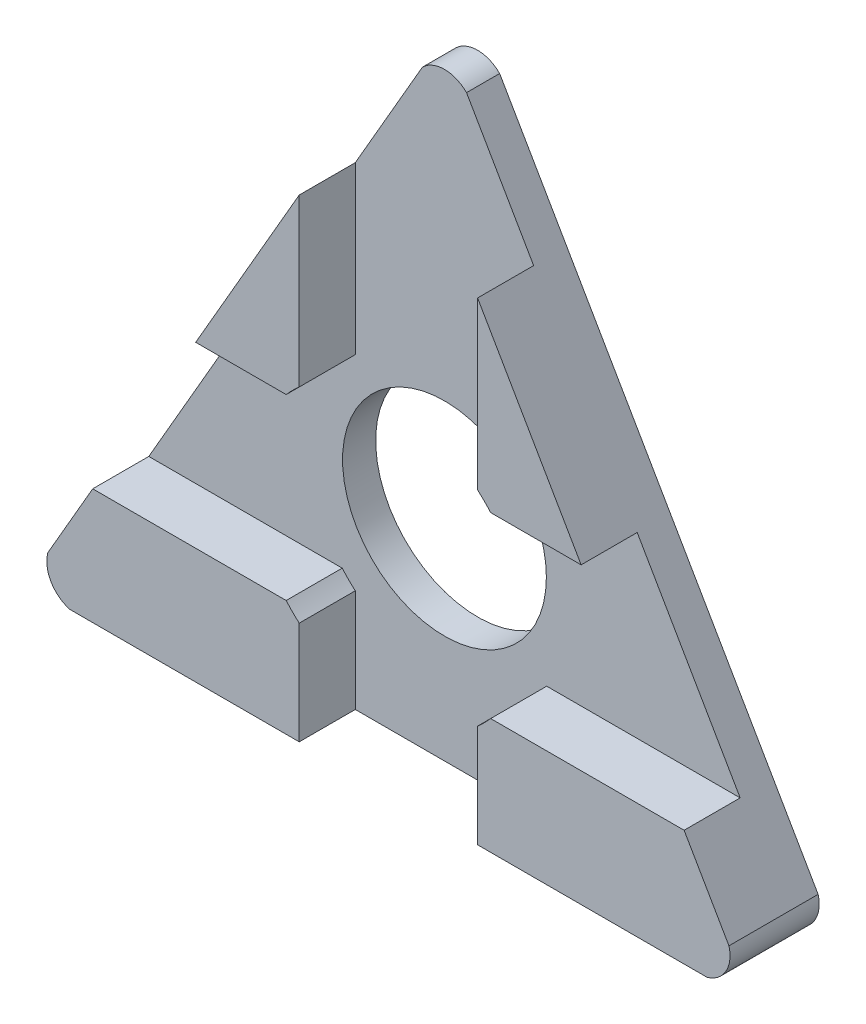
ISO-10303-21;
HEADER;
FILE_DESCRIPTION(('STEP AP214'),'2;1');
FILE_NAME('part.step','',(''),(''),'','','');
FILE_SCHEMA(('AUTOMOTIVE_DESIGN { 1 0 10303 214 1 1 1 1 }'));
ENDSEC;
DATA;
#1=APPLICATION_CONTEXT('core data for automotive mechanical design processes');
#2=APPLICATION_PROTOCOL_DEFINITION('international standard','automotive_design',2000,#1);
#3=PRODUCT_CONTEXT('',#1,'mechanical');
#4=PRODUCT('Part','Part','',(#3));
#5=PRODUCT_RELATED_PRODUCT_CATEGORY('part','',(#4));
#6=PRODUCT_DEFINITION_FORMATION('','',#4);
#7=PRODUCT_DEFINITION_CONTEXT('part definition',#1,'design');
#8=PRODUCT_DEFINITION('design','',#6,#7);
#9=PRODUCT_DEFINITION_SHAPE('','',#8);
#10=(LENGTH_UNIT() NAMED_UNIT(*) SI_UNIT(.MILLI.,.METRE.));
#11=(NAMED_UNIT(*) PLANE_ANGLE_UNIT() SI_UNIT($,.RADIAN.));
#12=(NAMED_UNIT(*) SI_UNIT($,.STERADIAN.) SOLID_ANGLE_UNIT());
#13=UNCERTAINTY_MEASURE_WITH_UNIT(LENGTH_MEASURE(1.E-05),#10,'distance_accuracy_value','');
#14=(GEOMETRIC_REPRESENTATION_CONTEXT(3) GLOBAL_UNCERTAINTY_ASSIGNED_CONTEXT((#13)) GLOBAL_UNIT_ASSIGNED_CONTEXT((#10,
#11,#12)) REPRESENTATION_CONTEXT('',''));
#15=CARTESIAN_POINT('',(0.,0.,0.));
#16=DIRECTION('',(0.,0.,1.));
#17=DIRECTION('',(1.,0.,0.));
#18=AXIS2_PLACEMENT_3D('',#15,#16,#17);
#19=CARTESIAN_POINT('',(0.,0.,3.5));
#20=DIRECTION('',(0.,0.,1.));
#21=DIRECTION('',(1.,0.,0.));
#22=AXIS2_PLACEMENT_3D('',#19,#20,#21);
#23=PLANE('',#22);
#24=DIRECTION('',(0.,-1.,0.));
#25=VECTOR('',#24,1.);
#26=CARTESIAN_POINT('',(-3.5,10.5487813318509,3.5));
#27=LINE('',#26,#25);
#28=CARTESIAN_POINT('',(-3.5,17.5884572681199,3.5));
#29=VERTEX_POINT('',#28);
#30=CARTESIAN_POINT('',(-3.5,11.0619627381669,3.5));
#31=VERTEX_POINT('',#30);
#32=EDGE_CURVE('E189',#29,#31,#27,.T.);
#33=ORIENTED_EDGE('',*,*,#32,.F.);
#34=DIRECTION('',(0.5,0.866025403784439,0.));
#35=VECTOR('',#34,1.);
#36=CARTESIAN_POINT('',(-0.866025403784438,22.150635094611,3.5));
#37=LINE('',#36,#35);
#38=CARTESIAN_POINT('',(-7.56435879681262,10.5487813318509,3.5));
#39=VERTEX_POINT('',#38);
#40=EDGE_CURVE('E201',#39,#29,#37,.T.);
#41=ORIENTED_EDGE('',*,*,#40,.F.);
#42=DIRECTION('',(-1.,0.,0.));
#43=VECTOR('',#42,1.);
#44=CARTESIAN_POINT('',(-19.2590358206957,10.5487813318509,3.5));
#45=LINE('',#44,#43);
#46=CARTESIAN_POINT('',(-4.01318140631594,10.5487813318509,3.5));
#47=VERTEX_POINT('',#46);
#48=EDGE_CURVE('E204',#47,#39,#45,.T.);
#49=ORIENTED_EDGE('',*,*,#48,.F.);
#50=CARTESIAN_POINT('',(0.,7.04878133185094,3.5));
#51=DIRECTION('',(0.,0.,1.));
#52=DIRECTION('',(1.,0.,0.));
#53=AXIS2_PLACEMENT_3D('',#50,#51,#52);
#54=CIRCLE('',#53,5.325);
#55=EDGE_CURVE('E203',#31,#47,#54,.T.);
#56=ORIENTED_EDGE('',*,*,#55,.F.);
#57=EDGE_LOOP('',(#33,#41,#49,#56));
#58=FACE_BOUND('',#57,.T.);
#59=ADVANCED_FACE('F35',(#58),#23,.T.);
#60=DIRECTION('',(0.,1.,0.));
#61=VECTOR('',#60,1.);
#62=CARTESIAN_POINT('',(3.5,10.5487813318509,3.5));
#63=LINE('',#62,#61);
#64=CARTESIAN_POINT('',(3.5,11.0619627381669,3.5));
#65=VERTEX_POINT('',#64);
#66=CARTESIAN_POINT('',(3.5,17.5884572681199,3.5));
#67=VERTEX_POINT('',#66);
#68=EDGE_CURVE('E333',#65,#67,#63,.T.);
#69=ORIENTED_EDGE('',*,*,#68,.F.);
#70=CARTESIAN_POINT('',(4.01318140631594,10.5487813318509,3.5));
#71=VERTEX_POINT('',#70);
#72=EDGE_CURVE('E282',#71,#65,#54,.T.);
#73=ORIENTED_EDGE('',*,*,#72,.F.);
#74=DIRECTION('',(-1.,0.,0.));
#75=VECTOR('',#74,1.);
#76=CARTESIAN_POINT('',(20.8756332372673,10.5487813318509,3.5));
#77=LINE('',#76,#75);
#78=CARTESIAN_POINT('',(7.56435879681262,10.5487813318509,3.5));
#79=VERTEX_POINT('',#78);
#80=EDGE_CURVE('E331',#79,#71,#77,.T.);
#81=ORIENTED_EDGE('',*,*,#80,.F.);
#82=DIRECTION('',(0.5,-0.866025403784439,0.));
#83=VECTOR('',#82,1.);
#84=CARTESIAN_POINT('',(0.866025403784439,22.150635094611,3.5));
#85=LINE('',#84,#83);
#86=EDGE_CURVE('E221',#67,#79,#85,.T.);
#87=ORIENTED_EDGE('',*,*,#86,.F.);
#88=EDGE_LOOP('',(#69,#73,#81,#87));
#89=FACE_BOUND('',#88,.T.);
#90=ADVANCED_FACE('F366',(#89),#23,.T.);
#91=DIRECTION('',(1.,0.,0.));
#92=VECTOR('',#91,1.);
#93=CARTESIAN_POINT('',(20.8756332372673,3.54878133185094,3.5));
#94=LINE('',#93,#92);
#95=CARTESIAN_POINT('',(4.01318140631594,3.54878133185094,3.5));
#96=VERTEX_POINT('',#95);
#97=CARTESIAN_POINT('',(11.60581068114,3.54878133185093,3.5));
#98=VERTEX_POINT('',#97);
#99=EDGE_CURVE('E325',#96,#98,#94,.T.);
#100=ORIENTED_EDGE('',*,*,#99,.F.);
#101=CARTESIAN_POINT('',(3.5,3.035599925535,3.5));
#102=VERTEX_POINT('',#101);
#103=EDGE_CURVE('E194',#102,#96,#54,.T.);
#104=ORIENTED_EDGE('',*,*,#103,.F.);
#105=DIRECTION('',(0.,1.,0.));
#106=VECTOR('',#105,1.);
#107=CARTESIAN_POINT('',(3.5,3.54878133185094,3.5));
#108=LINE('',#107,#106);
#109=CARTESIAN_POINT('',(3.5,-1.,3.5));
#110=VERTEX_POINT('',#109);
#111=EDGE_CURVE('E323',#110,#102,#108,.T.);
#112=ORIENTED_EDGE('',*,*,#111,.F.);
#113=DIRECTION('',(-1.,0.,0.));
#114=VECTOR('',#113,1.);
#115=CARTESIAN_POINT('',(-12.5,-1.,3.5));
#116=LINE('',#115,#114);
#117=CARTESIAN_POINT('',(12.5,-1.,3.5));
#118=VERTEX_POINT('',#117);
#119=EDGE_CURVE('E216',#118,#110,#116,.T.);
#120=ORIENTED_EDGE('',*,*,#119,.F.);
#121=CARTESIAN_POINT('',(12.1830127018922,0.183012701892222,3.5));
#122=DIRECTION('',(0.,0.,-1.));
#123=DIRECTION('',(1.,0.,0.));
#124=AXIS2_PLACEMENT_3D('',#121,#122,#123);
#125=CIRCLE('',#124,1.2247448713916);
#126=CARTESIAN_POINT('',(13.3660254037844,0.500000000000001,3.5));
#127=VERTEX_POINT('',#126);
#128=EDGE_CURVE('E241',#127,#118,#125,.T.);
#129=ORIENTED_EDGE('',*,*,#128,.F.);
#130=EDGE_CURVE('E214',#98,#127,#85,.T.);
#131=ORIENTED_EDGE('',*,*,#130,.F.);
#132=EDGE_LOOP('',(#100,#104,#112,#120,#129,#131));
#133=FACE_BOUND('',#132,.T.);
#134=ADVANCED_FACE('F402',(#133),#23,.T.);
#135=CARTESIAN_POINT('',(0.,7.04878133185094,1.3));
#136=DIRECTION('',(0.,0.,1.));
#137=DIRECTION('',(1.,0.,0.));
#138=AXIS2_PLACEMENT_3D('',#135,#136,#137);
#139=CYLINDRICAL_SURFACE('',#138,5.325);
#140=CARTESIAN_POINT('',(0.,7.04878133185094,1.3));
#141=DIRECTION('',(0.,0.,1.));
#142=DIRECTION('',(1.,0.,0.));
#143=AXIS2_PLACEMENT_3D('',#140,#141,#142);
#144=CIRCLE('',#143,5.325);
#145=CARTESIAN_POINT('',(-3.5,11.0619627381669,1.3));
#146=VERTEX_POINT('',#145);
#147=CARTESIAN_POINT('',(-4.01318140631594,10.5487813318509,1.3));
#148=VERTEX_POINT('',#147);
#149=EDGE_CURVE('E293',#146,#148,#144,.T.);
#150=ORIENTED_EDGE('',*,*,#149,.F.);
#151=DIRECTION('',(0.,0.,1.));
#152=VECTOR('',#151,1.);
#153=CARTESIAN_POINT('',(-3.5,11.0619627381669,1.3));
#154=LINE('',#153,#152);
#155=EDGE_CURVE('E11',#146,#31,#154,.T.);
#156=ORIENTED_EDGE('',*,*,#155,.T.);
#157=ORIENTED_EDGE('',*,*,#55,.T.);
#158=DIRECTION('',(0.,0.,1.));
#159=VECTOR('',#158,1.);
#160=CARTESIAN_POINT('',(-4.01318140631594,10.5487813318509,1.3));
#161=LINE('',#160,#159);
#162=EDGE_CURVE('E244',#47,#148,#161,.F.);
#163=ORIENTED_EDGE('',*,*,#162,.T.);
#164=EDGE_LOOP('',(#150,#156,#157,#163));
#165=FACE_BOUND('',#164,.T.);
#166=ADVANCED_FACE('F385',(#165),#139,.F.);
#167=ORIENTED_EDGE('',*,*,#72,.T.);
#168=DIRECTION('',(0.,0.,1.));
#169=VECTOR('',#168,1.);
#170=CARTESIAN_POINT('',(3.5,11.0619627381669,1.3));
#171=LINE('',#170,#169);
#172=CARTESIAN_POINT('',(3.5,11.0619627381669,1.3));
#173=VERTEX_POINT('',#172);
#174=EDGE_CURVE('E43',#65,#173,#171,.F.);
#175=ORIENTED_EDGE('',*,*,#174,.T.);
#176=CARTESIAN_POINT('',(4.01318140631594,10.5487813318509,1.3));
#177=VERTEX_POINT('',#176);
#178=EDGE_CURVE('E258',#177,#173,#144,.T.);
#179=ORIENTED_EDGE('',*,*,#178,.F.);
#180=DIRECTION('',(0.,0.,1.));
#181=VECTOR('',#180,1.);
#182=CARTESIAN_POINT('',(4.01318140631594,10.5487813318509,1.3));
#183=LINE('',#182,#181);
#184=EDGE_CURVE('E273',#177,#71,#183,.T.);
#185=ORIENTED_EDGE('',*,*,#184,.T.);
#186=EDGE_LOOP('',(#167,#175,#179,#185));
#187=FACE_BOUND('',#186,.T.);
#188=ADVANCED_FACE('F280',(#187),#139,.F.);
#189=ORIENTED_EDGE('',*,*,#103,.T.);
#190=DIRECTION('',(0.,0.,1.));
#191=VECTOR('',#190,1.);
#192=CARTESIAN_POINT('',(4.01318140631594,3.54878133185094,1.3));
#193=LINE('',#192,#191);
#194=CARTESIAN_POINT('',(4.01318140631594,3.54878133185094,1.3));
#195=VERTEX_POINT('',#194);
#196=EDGE_CURVE('E270',#96,#195,#193,.F.);
#197=ORIENTED_EDGE('',*,*,#196,.T.);
#198=CARTESIAN_POINT('',(3.5,3.035599925535,1.3));
#199=VERTEX_POINT('',#198);
#200=EDGE_CURVE('E295',#199,#195,#144,.T.);
#201=ORIENTED_EDGE('',*,*,#200,.F.);
#202=DIRECTION('',(0.,0.,1.));
#203=VECTOR('',#202,1.);
#204=CARTESIAN_POINT('',(3.5,3.035599925535,1.3));
#205=LINE('',#204,#203);
#206=EDGE_CURVE('E267',#199,#102,#205,.T.);
#207=ORIENTED_EDGE('',*,*,#206,.T.);
#208=EDGE_LOOP('',(#189,#197,#201,#207));
#209=FACE_BOUND('',#208,.T.);
#210=ADVANCED_FACE('F406',(#209),#139,.F.);
#211=CARTESIAN_POINT('',(0.,7.24327674041975,0.));
#212=DIRECTION('',(0.,0.,1.));
#213=DIRECTION('',(1.,0.,0.));
#214=AXIS2_PLACEMENT_3D('',#211,#212,#213);
#215=CYLINDRICAL_SURFACE('',#214,4.);
#216=CARTESIAN_POINT('',(0.,7.24327674041975,0.));
#217=DIRECTION('',(0.,0.,1.));
#218=DIRECTION('',(1.,0.,0.));
#219=AXIS2_PLACEMENT_3D('',#216,#217,#218);
#220=CIRCLE('',#219,4.);
#221=CARTESIAN_POINT('',(4.,7.24327674041975,0.));
#222=VERTEX_POINT('',#221);
#223=EDGE_CURVE('E226',#222,#222,#220,.T.);
#224=ORIENTED_EDGE('',*,*,#223,.F.);
#225=EDGE_LOOP('',(#224));
#226=FACE_BOUND('',#225,.T.);
#227=CARTESIAN_POINT('',(0.,7.24327674041975,1.3));
#228=DIRECTION('',(0.,0.,1.));
#229=DIRECTION('',(1.,0.,0.));
#230=AXIS2_PLACEMENT_3D('',#227,#228,#229);
#231=CIRCLE('',#230,4.);
#232=CARTESIAN_POINT('',(4.,7.24327674041975,1.3));
#233=VERTEX_POINT('',#232);
#234=EDGE_CURVE('E255',#233,#233,#231,.F.);
#235=ORIENTED_EDGE('',*,*,#234,.F.);
#236=EDGE_LOOP('',(#235));
#237=FACE_BOUND('',#236,.T.);
#238=ADVANCED_FACE('F408',(#226,#237),#215,.F.);
#239=DIRECTION('',(0.,-1.,0.));
#240=VECTOR('',#239,1.);
#241=CARTESIAN_POINT('',(-3.5,3.54878133185094,3.5));
#242=LINE('',#241,#240);
#243=CARTESIAN_POINT('',(-3.5,3.035599925535,3.5));
#244=VERTEX_POINT('',#243);
#245=CARTESIAN_POINT('',(-3.5,-1.,3.5));
#246=VERTEX_POINT('',#245);
#247=EDGE_CURVE('E318',#244,#246,#242,.T.);
#248=ORIENTED_EDGE('',*,*,#247,.F.);
#249=CARTESIAN_POINT('',(-4.01318140631594,3.54878133185094,3.5));
#250=VERTEX_POINT('',#249);
#251=EDGE_CURVE('E301',#250,#244,#54,.T.);
#252=ORIENTED_EDGE('',*,*,#251,.F.);
#253=DIRECTION('',(1.,0.,0.));
#254=VECTOR('',#253,1.);
#255=CARTESIAN_POINT('',(-19.2590358206957,3.54878133185094,3.5));
#256=LINE('',#255,#254);
#257=CARTESIAN_POINT('',(-11.60581068114,3.54878133185093,3.5));
#258=VERTEX_POINT('',#257);
#259=EDGE_CURVE('E316',#258,#250,#256,.T.);
#260=ORIENTED_EDGE('',*,*,#259,.F.);
#261=CARTESIAN_POINT('',(-13.3660254037844,0.500000000000001,3.5));
#262=VERTEX_POINT('',#261);
#263=EDGE_CURVE('E210',#262,#258,#37,.T.);
#264=ORIENTED_EDGE('',*,*,#263,.F.);
#265=CARTESIAN_POINT('',(-12.1830127018922,0.183012701892222,3.5));
#266=DIRECTION('',(0.,0.,-1.));
#267=DIRECTION('',(1.,0.,0.));
#268=AXIS2_PLACEMENT_3D('',#265,#266,#267);
#269=CIRCLE('',#268,1.22474487139159);
#270=CARTESIAN_POINT('',(-12.5,-1.,3.5));
#271=VERTEX_POINT('',#270);
#272=EDGE_CURVE('E211',#271,#262,#269,.T.);
#273=ORIENTED_EDGE('',*,*,#272,.F.);
#274=EDGE_CURVE('E320',#246,#271,#116,.T.);
#275=ORIENTED_EDGE('',*,*,#274,.F.);
#276=EDGE_LOOP('',(#248,#252,#260,#264,#273,#275));
#277=FACE_BOUND('',#276,.T.);
#278=ADVANCED_FACE('F314',(#277),#23,.T.);
#279=CARTESIAN_POINT('',(12.1830127018922,0.183012701892222,3.5));
#280=DIRECTION('',(0.,0.,-1.));
#281=DIRECTION('',(-1.,0.,0.));
#282=AXIS2_PLACEMENT_3D('',#279,#280,#281);
#283=CYLINDRICAL_SURFACE('',#282,1.2247448713916);
#284=CARTESIAN_POINT('',(12.1830127018922,0.183012701892222,0.));
#285=DIRECTION('',(0.,0.,-1.));
#286=DIRECTION('',(1.,0.,0.));
#287=AXIS2_PLACEMENT_3D('',#284,#285,#286);
#288=CIRCLE('',#287,1.2247448713916);
#289=CARTESIAN_POINT('',(13.3660254037844,0.500000000000001,0.));
#290=VERTEX_POINT('',#289);
#291=CARTESIAN_POINT('',(12.5,-1.,0.));
#292=VERTEX_POINT('',#291);
#293=EDGE_CURVE('E222',#290,#292,#288,.T.);
#294=ORIENTED_EDGE('',*,*,#293,.F.);
#295=DIRECTION('',(0.,0.,-1.));
#296=VECTOR('',#295,1.);
#297=CARTESIAN_POINT('',(13.3660254037844,0.500000000000001,3.5));
#298=LINE('',#297,#296);
#299=EDGE_CURVE('E242',#127,#290,#298,.T.);
#300=ORIENTED_EDGE('',*,*,#299,.F.);
#301=ORIENTED_EDGE('',*,*,#128,.T.);
#302=DIRECTION('',(0.,0.,-1.));
#303=VECTOR('',#302,1.);
#304=CARTESIAN_POINT('',(12.5,-1.,3.5));
#305=LINE('',#304,#303);
#306=EDGE_CURVE('E253',#118,#292,#305,.T.);
#307=ORIENTED_EDGE('',*,*,#306,.T.);
#308=EDGE_LOOP('',(#294,#300,#301,#307));
#309=FACE_BOUND('',#308,.T.);
#310=ADVANCED_FACE('F425',(#309),#283,.T.);
#311=CARTESIAN_POINT('',(0.866025403784439,22.150635094611,3.5));
#312=DIRECTION('',(0.866025403784439,0.5,0.));
#313=DIRECTION('',(-0.5,0.866025403784439,0.));
#314=AXIS2_PLACEMENT_3D('',#311,#312,#313);
#315=PLANE('',#314);
#316=DIRECTION('',(0.,0.,1.));
#317=VECTOR('',#316,1.);
#318=CARTESIAN_POINT('',(7.56435879681261,10.5487813318509,3.5));
#319=LINE('',#318,#317);
#320=CARTESIAN_POINT('',(7.56435879681262,10.5487813318509,1.3));
#321=VERTEX_POINT('',#320);
#322=EDGE_CURVE('E354',#321,#79,#319,.T.);
#323=ORIENTED_EDGE('',*,*,#322,.F.);
#324=DIRECTION('',(-0.5,0.866025403784439,0.));
#325=VECTOR('',#324,1.);
#326=CARTESIAN_POINT('',(0.866025403784439,22.150635094611,1.3));
#327=LINE('',#326,#325);
#328=CARTESIAN_POINT('',(11.60581068114,3.54878133185093,1.3));
#329=VERTEX_POINT('',#328);
#330=EDGE_CURVE('E344',#329,#321,#327,.T.);
#331=ORIENTED_EDGE('',*,*,#330,.F.);
#332=DIRECTION('',(0.,0.,-1.));
#333=VECTOR('',#332,1.);
#334=CARTESIAN_POINT('',(11.60581068114,3.54878133185094,3.5));
#335=LINE('',#334,#333);
#336=EDGE_CURVE('E352',#98,#329,#335,.T.);
#337=ORIENTED_EDGE('',*,*,#336,.F.);
#338=ORIENTED_EDGE('',*,*,#130,.T.);
#339=ORIENTED_EDGE('',*,*,#299,.T.);
#340=DIRECTION('',(0.5,-0.866025403784439,0.));
#341=VECTOR('',#340,1.);
#342=CARTESIAN_POINT('',(0.866025403784439,22.150635094611,0.));
#343=LINE('',#342,#341);
#344=CARTESIAN_POINT('',(0.866025403784439,22.150635094611,0.));
#345=VERTEX_POINT('',#344);
#346=EDGE_CURVE('E238',#345,#290,#343,.T.);
#347=ORIENTED_EDGE('',*,*,#346,.F.);
#348=DIRECTION('',(0.,0.,-1.));
#349=VECTOR('',#348,1.);
#350=CARTESIAN_POINT('',(0.866025403784439,22.150635094611,3.5));
#351=LINE('',#350,#349);
#352=CARTESIAN_POINT('',(0.866025403784439,22.150635094611,1.3));
#353=VERTEX_POINT('',#352);
#354=EDGE_CURVE('E245',#353,#345,#351,.T.);
#355=ORIENTED_EDGE('',*,*,#354,.F.);
#356=CARTESIAN_POINT('',(3.5,17.5884572681199,1.3));
#357=VERTEX_POINT('',#356);
#358=EDGE_CURVE('E342',#357,#353,#327,.T.);
#359=ORIENTED_EDGE('',*,*,#358,.F.);
#360=DIRECTION('',(0.,0.,-1.));
#361=VECTOR('',#360,1.);
#362=CARTESIAN_POINT('',(3.5,17.5884572681199,3.5));
#363=LINE('',#362,#361);
#364=EDGE_CURVE('E195',#67,#357,#363,.T.);
#365=ORIENTED_EDGE('',*,*,#364,.F.);
#366=ORIENTED_EDGE('',*,*,#86,.T.);
#367=EDGE_LOOP('',(#323,#331,#337,#338,#339,#347,#355,#359,#365,#366));
#368=FACE_BOUND('',#367,.T.);
#369=ADVANCED_FACE('F362',(#368),#315,.T.);
#370=CARTESIAN_POINT('',(0.,21.2846096908265,3.5));
#371=DIRECTION('',(0.,0.,-1.));
#372=DIRECTION('',(-1.,0.,0.));
#373=AXIS2_PLACEMENT_3D('',#370,#371,#372);
#374=CYLINDRICAL_SURFACE('',#373,1.22474487139159);
#375=CARTESIAN_POINT('',(0.,21.2846096908265,1.3));
#376=DIRECTION('',(0.,0.,-1.));
#377=DIRECTION('',(-1.,0.,0.));
#378=AXIS2_PLACEMENT_3D('',#375,#376,#377);
#379=CIRCLE('',#378,1.22474487139159);
#380=CARTESIAN_POINT('',(-0.866025403784438,22.150635094611,1.3));
#381=VERTEX_POINT('',#380);
#382=EDGE_CURVE('E340',#353,#381,#379,.F.);
#383=ORIENTED_EDGE('',*,*,#382,.F.);
#384=ORIENTED_EDGE('',*,*,#354,.T.);
#385=CARTESIAN_POINT('',(0.,21.2846096908265,0.));
#386=DIRECTION('',(0.,0.,-1.));
#387=DIRECTION('',(1.,0.,0.));
#388=AXIS2_PLACEMENT_3D('',#385,#386,#387);
#389=CIRCLE('',#388,1.22474487139159);
#390=CARTESIAN_POINT('',(-0.866025403784438,22.150635094611,0.));
#391=VERTEX_POINT('',#390);
#392=EDGE_CURVE('E235',#391,#345,#389,.T.);
#393=ORIENTED_EDGE('',*,*,#392,.F.);
#394=DIRECTION('',(0.,0.,-1.));
#395=VECTOR('',#394,1.);
#396=CARTESIAN_POINT('',(-0.866025403784438,22.150635094611,3.5));
#397=LINE('',#396,#395);
#398=EDGE_CURVE('E247',#381,#391,#397,.T.);
#399=ORIENTED_EDGE('',*,*,#398,.F.);
#400=EDGE_LOOP('',(#383,#384,#393,#399));
#401=FACE_BOUND('',#400,.T.);
#402=ADVANCED_FACE('F508',(#401),#374,.T.);
#403=CARTESIAN_POINT('',(-0.866025403784438,22.150635094611,3.5));
#404=DIRECTION('',(-0.866025403784439,0.5,0.));
#405=DIRECTION('',(-0.5,-0.866025403784439,0.));
#406=AXIS2_PLACEMENT_3D('',#403,#404,#405);
#407=PLANE('',#406);
#408=DIRECTION('',(0.,0.,1.));
#409=VECTOR('',#408,1.);
#410=CARTESIAN_POINT('',(-3.5,17.5884572681199,3.5));
#411=LINE('',#410,#409);
#412=CARTESIAN_POINT('',(-3.5,17.5884572681199,1.3));
#413=VERTEX_POINT('',#412);
#414=EDGE_CURVE('E185',#413,#29,#411,.T.);
#415=ORIENTED_EDGE('',*,*,#414,.F.);
#416=DIRECTION('',(-0.5,-0.866025403784439,0.));
#417=VECTOR('',#416,1.);
#418=CARTESIAN_POINT('',(-0.866025403784438,22.150635094611,1.3));
#419=LINE('',#418,#417);
#420=EDGE_CURVE('E339',#381,#413,#419,.T.);
#421=ORIENTED_EDGE('',*,*,#420,.F.);
#422=ORIENTED_EDGE('',*,*,#398,.T.);
#423=DIRECTION('',(0.5,0.866025403784439,0.));
#424=VECTOR('',#423,1.);
#425=CARTESIAN_POINT('',(-0.866025403784438,22.150635094611,0.));
#426=LINE('',#425,#424);
#427=CARTESIAN_POINT('',(-13.3660254037844,0.500000000000001,0.));
#428=VERTEX_POINT('',#427);
#429=EDGE_CURVE('E232',#428,#391,#426,.T.);
#430=ORIENTED_EDGE('',*,*,#429,.F.);
#431=DIRECTION('',(0.,0.,-1.));
#432=VECTOR('',#431,1.);
#433=CARTESIAN_POINT('',(-13.3660254037844,0.500000000000001,3.5));
#434=LINE('',#433,#432);
#435=EDGE_CURVE('E249',#262,#428,#434,.T.);
#436=ORIENTED_EDGE('',*,*,#435,.F.);
#437=ORIENTED_EDGE('',*,*,#263,.T.);
#438=DIRECTION('',(0.,0.,1.));
#439=VECTOR('',#438,1.);
#440=CARTESIAN_POINT('',(-11.60581068114,3.54878133185094,3.5));
#441=LINE('',#440,#439);
#442=CARTESIAN_POINT('',(-11.60581068114,3.54878133185093,1.3));
#443=VERTEX_POINT('',#442);
#444=EDGE_CURVE('E346',#443,#258,#441,.T.);
#445=ORIENTED_EDGE('',*,*,#444,.F.);
#446=CARTESIAN_POINT('',(-7.56435879681262,10.5487813318509,1.3));
#447=VERTEX_POINT('',#446);
#448=EDGE_CURVE('E337',#447,#443,#419,.T.);
#449=ORIENTED_EDGE('',*,*,#448,.F.);
#450=DIRECTION('',(0.,0.,-1.));
#451=VECTOR('',#450,1.);
#452=CARTESIAN_POINT('',(-7.56435879681261,10.5487813318509,3.5));
#453=LINE('',#452,#451);
#454=EDGE_CURVE('E209',#39,#447,#453,.T.);
#455=ORIENTED_EDGE('',*,*,#454,.F.);
#456=ORIENTED_EDGE('',*,*,#40,.T.);
#457=EDGE_LOOP('',(#415,#421,#422,#430,#436,#437,#445,#449,#455,#456));
#458=FACE_BOUND('',#457,.T.);
#459=ADVANCED_FACE('F207',(#458),#407,.T.);
#460=CARTESIAN_POINT('',(-12.1830127018922,0.183012701892222,3.5));
#461=DIRECTION('',(0.,0.,-1.));
#462=DIRECTION('',(-1.,0.,0.));
#463=AXIS2_PLACEMENT_3D('',#460,#461,#462);
#464=CYLINDRICAL_SURFACE('',#463,1.22474487139159);
#465=CARTESIAN_POINT('',(-12.1830127018922,0.183012701892222,0.));
#466=DIRECTION('',(0.,0.,-1.));
#467=DIRECTION('',(1.,0.,0.));
#468=AXIS2_PLACEMENT_3D('',#465,#466,#467);
#469=CIRCLE('',#468,1.22474487139159);
#470=CARTESIAN_POINT('',(-12.5,-1.,0.));
#471=VERTEX_POINT('',#470);
#472=EDGE_CURVE('E229',#471,#428,#469,.T.);
#473=ORIENTED_EDGE('',*,*,#472,.F.);
#474=DIRECTION('',(0.,0.,-1.));
#475=VECTOR('',#474,1.);
#476=CARTESIAN_POINT('',(-12.5,-1.,3.5));
#477=LINE('',#476,#475);
#478=EDGE_CURVE('E251',#271,#471,#477,.T.);
#479=ORIENTED_EDGE('',*,*,#478,.F.);
#480=ORIENTED_EDGE('',*,*,#272,.T.);
#481=ORIENTED_EDGE('',*,*,#435,.T.);
#482=EDGE_LOOP('',(#473,#479,#480,#481));
#483=FACE_BOUND('',#482,.T.);
#484=ADVANCED_FACE('F491',(#483),#464,.T.);
#485=CARTESIAN_POINT('',(-12.5,-1.,3.5));
#486=DIRECTION('',(0.,-1.,0.));
#487=DIRECTION('',(1.,0.,0.));
#488=AXIS2_PLACEMENT_3D('',#485,#486,#487);
#489=PLANE('',#488);
#490=DIRECTION('',(0.,0.,1.));
#491=VECTOR('',#490,1.);
#492=CARTESIAN_POINT('',(3.5,-1.,3.5));
#493=LINE('',#492,#491);
#494=CARTESIAN_POINT('',(3.5,-1.,1.3));
#495=VERTEX_POINT('',#494);
#496=EDGE_CURVE('E350',#495,#110,#493,.T.);
#497=ORIENTED_EDGE('',*,*,#496,.F.);
#498=DIRECTION('',(1.,0.,0.));
#499=VECTOR('',#498,1.);
#500=CARTESIAN_POINT('',(-12.5,-1.,1.3));
#501=LINE('',#500,#499);
#502=CARTESIAN_POINT('',(-3.5,-1.,1.3));
#503=VERTEX_POINT('',#502);
#504=EDGE_CURVE('E335',#503,#495,#501,.T.);
#505=ORIENTED_EDGE('',*,*,#504,.F.);
#506=DIRECTION('',(0.,0.,-1.));
#507=VECTOR('',#506,1.);
#508=CARTESIAN_POINT('',(-3.5,-1.,3.5));
#509=LINE('',#508,#507);
#510=EDGE_CURVE('E348',#246,#503,#509,.T.);
#511=ORIENTED_EDGE('',*,*,#510,.F.);
#512=ORIENTED_EDGE('',*,*,#274,.T.);
#513=ORIENTED_EDGE('',*,*,#478,.T.);
#514=DIRECTION('',(-1.,0.,0.));
#515=VECTOR('',#514,1.);
#516=CARTESIAN_POINT('',(-12.5,-1.,0.));
#517=LINE('',#516,#515);
#518=EDGE_CURVE('E225',#292,#471,#517,.T.);
#519=ORIENTED_EDGE('',*,*,#518,.F.);
#520=ORIENTED_EDGE('',*,*,#306,.F.);
#521=ORIENTED_EDGE('',*,*,#119,.T.);
#522=EDGE_LOOP('',(#497,#505,#511,#512,#513,#519,#520,#521));
#523=FACE_BOUND('',#522,.T.);
#524=ADVANCED_FACE('F394',(#523),#489,.T.);
#525=CARTESIAN_POINT('',(0.,0.,0.));
#526=DIRECTION('',(0.,0.,1.));
#527=DIRECTION('',(1.,0.,0.));
#528=AXIS2_PLACEMENT_3D('',#525,#526,#527);
#529=PLANE('',#528);
#530=ORIENTED_EDGE('',*,*,#223,.T.);
#531=EDGE_LOOP('',(#530));
#532=FACE_BOUND('',#531,.T.);
#533=ORIENTED_EDGE('',*,*,#293,.T.);
#534=ORIENTED_EDGE('',*,*,#518,.T.);
#535=ORIENTED_EDGE('',*,*,#472,.T.);
#536=ORIENTED_EDGE('',*,*,#429,.T.);
#537=ORIENTED_EDGE('',*,*,#392,.T.);
#538=ORIENTED_EDGE('',*,*,#346,.T.);
#539=EDGE_LOOP('',(#533,#534,#535,#536,#537,#538));
#540=FACE_BOUND('',#539,.T.);
#541=ADVANCED_FACE('F37',(#532,#540),#529,.F.);
#542=CARTESIAN_POINT('',(0.,7.04878133185094,1.3));
#543=DIRECTION('',(0.,0.,1.));
#544=DIRECTION('',(1.,0.,0.));
#545=AXIS2_PLACEMENT_3D('',#542,#543,#544);
#546=PLANE('',#545);
#547=ORIENTED_EDGE('',*,*,#178,.T.);
#548=DIRECTION('',(0.,1.,0.));
#549=VECTOR('',#548,1.);
#550=CARTESIAN_POINT('',(3.5,10.5487813318509,1.3));
#551=LINE('',#550,#549);
#552=EDGE_CURVE('E288',#173,#357,#551,.T.);
#553=ORIENTED_EDGE('',*,*,#552,.T.);
#554=ORIENTED_EDGE('',*,*,#358,.T.);
#555=ORIENTED_EDGE('',*,*,#382,.T.);
#556=ORIENTED_EDGE('',*,*,#420,.T.);
#557=DIRECTION('',(0.,-1.,0.));
#558=VECTOR('',#557,1.);
#559=CARTESIAN_POINT('',(-3.5,10.5487813318509,1.3));
#560=LINE('',#559,#558);
#561=EDGE_CURVE('E190',#413,#146,#560,.T.);
#562=ORIENTED_EDGE('',*,*,#561,.T.);
#563=ORIENTED_EDGE('',*,*,#149,.T.);
#564=DIRECTION('',(-1.,0.,0.));
#565=VECTOR('',#564,1.);
#566=CARTESIAN_POINT('',(-19.2590358206957,10.5487813318509,1.3));
#567=LINE('',#566,#565);
#568=EDGE_CURVE('E386',#148,#447,#567,.T.);
#569=ORIENTED_EDGE('',*,*,#568,.T.);
#570=ORIENTED_EDGE('',*,*,#448,.T.);
#571=DIRECTION('',(1.,0.,0.));
#572=VECTOR('',#571,1.);
#573=CARTESIAN_POINT('',(-19.2590358206957,3.54878133185094,1.3));
#574=LINE('',#573,#572);
#575=CARTESIAN_POINT('',(-4.01318140631594,3.54878133185094,1.3));
#576=VERTEX_POINT('',#575);
#577=EDGE_CURVE('E57',#443,#576,#574,.T.);
#578=ORIENTED_EDGE('',*,*,#577,.T.);
#579=CARTESIAN_POINT('',(-3.5,3.035599925535,1.3));
#580=VERTEX_POINT('',#579);
#581=EDGE_CURVE('E297',#576,#580,#144,.T.);
#582=ORIENTED_EDGE('',*,*,#581,.T.);
#583=DIRECTION('',(0.,-1.,0.));
#584=VECTOR('',#583,1.);
#585=CARTESIAN_POINT('',(-3.5,3.54878133185094,1.3));
#586=LINE('',#585,#584);
#587=EDGE_CURVE('E376',#580,#503,#586,.T.);
#588=ORIENTED_EDGE('',*,*,#587,.T.);
#589=ORIENTED_EDGE('',*,*,#504,.T.);
#590=DIRECTION('',(0.,1.,0.));
#591=VECTOR('',#590,1.);
#592=CARTESIAN_POINT('',(3.5,3.54878133185094,1.3));
#593=LINE('',#592,#591);
#594=EDGE_CURVE('E50',#495,#199,#593,.T.);
#595=ORIENTED_EDGE('',*,*,#594,.T.);
#596=ORIENTED_EDGE('',*,*,#200,.T.);
#597=DIRECTION('',(1.,0.,0.));
#598=VECTOR('',#597,1.);
#599=CARTESIAN_POINT('',(20.8756332372673,3.54878133185094,1.3));
#600=LINE('',#599,#598);
#601=EDGE_CURVE('E372',#195,#329,#600,.T.);
#602=ORIENTED_EDGE('',*,*,#601,.T.);
#603=ORIENTED_EDGE('',*,*,#330,.T.);
#604=DIRECTION('',(-1.,0.,0.));
#605=VECTOR('',#604,1.);
#606=CARTESIAN_POINT('',(20.8756332372673,10.5487813318509,1.3));
#607=LINE('',#606,#605);
#608=EDGE_CURVE('E291',#321,#177,#607,.T.);
#609=ORIENTED_EDGE('',*,*,#608,.T.);
#610=EDGE_LOOP('',(#547,#553,#554,#555,#556,#562,#563,#569,#570,#578,#582,#588,#589,#595,#596,
#602,#603,#609));
#611=FACE_BOUND('',#610,.T.);
#612=ORIENTED_EDGE('',*,*,#234,.T.);
#613=EDGE_LOOP('',(#612));
#614=FACE_BOUND('',#613,.T.);
#615=ADVANCED_FACE('F286',(#611,#614),#546,.T.);
#616=ORIENTED_EDGE('',*,*,#251,.T.);
#617=DIRECTION('',(0.,0.,1.));
#618=VECTOR('',#617,1.);
#619=CARTESIAN_POINT('',(-3.5,3.035599925535,1.3));
#620=LINE('',#619,#618);
#621=EDGE_CURVE('E264',#244,#580,#620,.F.);
#622=ORIENTED_EDGE('',*,*,#621,.T.);
#623=ORIENTED_EDGE('',*,*,#581,.F.);
#624=DIRECTION('',(0.,0.,1.));
#625=VECTOR('',#624,1.);
#626=CARTESIAN_POINT('',(-4.01318140631594,3.54878133185094,1.3));
#627=LINE('',#626,#625);
#628=EDGE_CURVE('E261',#576,#250,#627,.T.);
#629=ORIENTED_EDGE('',*,*,#628,.T.);
#630=EDGE_LOOP('',(#616,#622,#623,#629));
#631=FACE_BOUND('',#630,.T.);
#632=ADVANCED_FACE('F309',(#631),#139,.F.);
#633=CARTESIAN_POINT('',(-19.2590358206957,10.5487813318509,1.3));
#634=DIRECTION('',(0.,1.,0.));
#635=DIRECTION('',(0.,0.,1.));
#636=AXIS2_PLACEMENT_3D('',#633,#634,#635);
#637=PLANE('',#636);
#638=ORIENTED_EDGE('',*,*,#454,.T.);
#639=ORIENTED_EDGE('',*,*,#568,.F.);
#640=ORIENTED_EDGE('',*,*,#162,.F.);
#641=ORIENTED_EDGE('',*,*,#48,.T.);
#642=EDGE_LOOP('',(#638,#639,#640,#641));
#643=FACE_BOUND('',#642,.T.);
#644=ADVANCED_FACE('F381',(#643),#637,.F.);
#645=CARTESIAN_POINT('',(-19.2590358206957,3.54878133185094,1.3));
#646=DIRECTION('',(0.,-1.,0.));
#647=DIRECTION('',(0.,0.,-1.));
#648=AXIS2_PLACEMENT_3D('',#645,#646,#647);
#649=PLANE('',#648);
#650=ORIENTED_EDGE('',*,*,#444,.T.);
#651=ORIENTED_EDGE('',*,*,#259,.T.);
#652=ORIENTED_EDGE('',*,*,#628,.F.);
#653=ORIENTED_EDGE('',*,*,#577,.F.);
#654=EDGE_LOOP('',(#650,#651,#652,#653));
#655=FACE_BOUND('',#654,.T.);
#656=ADVANCED_FACE('F545',(#655),#649,.F.);
#657=CARTESIAN_POINT('',(3.5,10.5487813318509,1.3));
#658=DIRECTION('',(1.,0.,0.));
#659=DIRECTION('',(0.,1.,0.));
#660=AXIS2_PLACEMENT_3D('',#657,#658,#659);
#661=PLANE('',#660);
#662=ORIENTED_EDGE('',*,*,#364,.T.);
#663=ORIENTED_EDGE('',*,*,#552,.F.);
#664=ORIENTED_EDGE('',*,*,#174,.F.);
#665=ORIENTED_EDGE('',*,*,#68,.T.);
#666=EDGE_LOOP('',(#662,#663,#664,#665));
#667=FACE_BOUND('',#666,.T.);
#668=ADVANCED_FACE('F357',(#667),#661,.F.);
#669=CARTESIAN_POINT('',(-3.5,10.5487813318509,1.3));
#670=DIRECTION('',(-1.,0.,0.));
#671=DIRECTION('',(0.,-1.,0.));
#672=AXIS2_PLACEMENT_3D('',#669,#670,#671);
#673=PLANE('',#672);
#674=ORIENTED_EDGE('',*,*,#414,.T.);
#675=ORIENTED_EDGE('',*,*,#32,.T.);
#676=ORIENTED_EDGE('',*,*,#155,.F.);
#677=ORIENTED_EDGE('',*,*,#561,.F.);
#678=EDGE_LOOP('',(#674,#675,#676,#677));
#679=FACE_BOUND('',#678,.T.);
#680=ADVANCED_FACE('F187',(#679),#673,.F.);
#681=CARTESIAN_POINT('',(20.8756332372673,3.54878133185094,1.3));
#682=DIRECTION('',(0.,-1.,0.));
#683=DIRECTION('',(0.,0.,-1.));
#684=AXIS2_PLACEMENT_3D('',#681,#682,#683);
#685=PLANE('',#684);
#686=ORIENTED_EDGE('',*,*,#336,.T.);
#687=ORIENTED_EDGE('',*,*,#601,.F.);
#688=ORIENTED_EDGE('',*,*,#196,.F.);
#689=ORIENTED_EDGE('',*,*,#99,.T.);
#690=EDGE_LOOP('',(#686,#687,#688,#689));
#691=FACE_BOUND('',#690,.T.);
#692=ADVANCED_FACE('F405',(#691),#685,.F.);
#693=CARTESIAN_POINT('',(20.8756332372673,10.5487813318509,1.3));
#694=DIRECTION('',(0.,1.,0.));
#695=DIRECTION('',(0.,0.,1.));
#696=AXIS2_PLACEMENT_3D('',#693,#694,#695);
#697=PLANE('',#696);
#698=ORIENTED_EDGE('',*,*,#322,.T.);
#699=ORIENTED_EDGE('',*,*,#80,.T.);
#700=ORIENTED_EDGE('',*,*,#184,.F.);
#701=ORIENTED_EDGE('',*,*,#608,.F.);
#702=EDGE_LOOP('',(#698,#699,#700,#701));
#703=FACE_BOUND('',#702,.T.);
#704=ADVANCED_FACE('F368',(#703),#697,.F.);
#705=CARTESIAN_POINT('',(3.5,3.54878133185094,1.3));
#706=DIRECTION('',(1.,0.,0.));
#707=DIRECTION('',(0.,0.,-1.));
#708=AXIS2_PLACEMENT_3D('',#705,#706,#707);
#709=PLANE('',#708);
#710=ORIENTED_EDGE('',*,*,#496,.T.);
#711=ORIENTED_EDGE('',*,*,#111,.T.);
#712=ORIENTED_EDGE('',*,*,#206,.F.);
#713=ORIENTED_EDGE('',*,*,#594,.F.);
#714=EDGE_LOOP('',(#710,#711,#712,#713));
#715=FACE_BOUND('',#714,.T.);
#716=ADVANCED_FACE('F399',(#715),#709,.F.);
#717=CARTESIAN_POINT('',(-3.5,3.54878133185094,1.3));
#718=DIRECTION('',(-1.,0.,0.));
#719=DIRECTION('',(0.,0.,1.));
#720=AXIS2_PLACEMENT_3D('',#717,#718,#719);
#721=PLANE('',#720);
#722=ORIENTED_EDGE('',*,*,#510,.T.);
#723=ORIENTED_EDGE('',*,*,#587,.F.);
#724=ORIENTED_EDGE('',*,*,#621,.F.);
#725=ORIENTED_EDGE('',*,*,#247,.T.);
#726=EDGE_LOOP('',(#722,#723,#724,#725));
#727=FACE_BOUND('',#726,.T.);
#728=ADVANCED_FACE('F582',(#727),#721,.F.);
#729=CLOSED_SHELL('',(#59,#90,#134,#166,#188,#210,#238,#278,#310,#369,#402,#459,#484,#524,#541,
#615,#632,#644,#656,#668,#680,#692,#704,#716,#728));
#730=MANIFOLD_SOLID_BREP('B2',#729);
#731=ADVANCED_BREP_SHAPE_REPRESENTATION('',(#18,#730),#14);
#732=SHAPE_DEFINITION_REPRESENTATION(#9,#731);
ENDSEC;
END-ISO-10303-21;
